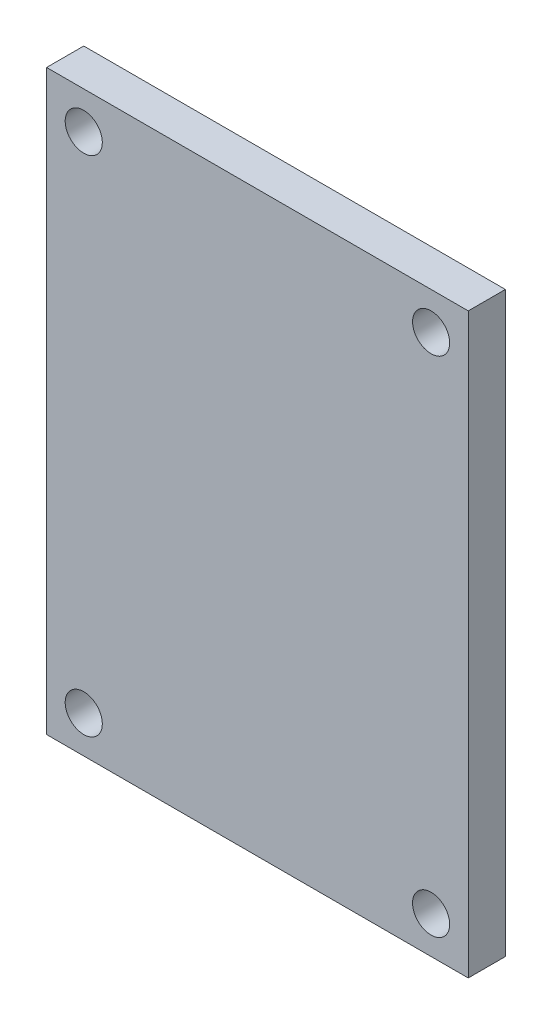
ISO-10303-21;
HEADER;
FILE_DESCRIPTION(('STEP AP214'),'2;1');
FILE_NAME('part.step','',(''),(''),'','','');
FILE_SCHEMA(('AUTOMOTIVE_DESIGN { 1 0 10303 214 1 1 1 1 }'));
ENDSEC;
DATA;
#1=APPLICATION_CONTEXT('core data for automotive mechanical design processes');
#2=APPLICATION_PROTOCOL_DEFINITION('international standard','automotive_design',2000,#1);
#3=PRODUCT_CONTEXT('',#1,'mechanical');
#4=PRODUCT('Part','Part','',(#3));
#5=PRODUCT_RELATED_PRODUCT_CATEGORY('part','',(#4));
#6=PRODUCT_DEFINITION_FORMATION('','',#4);
#7=PRODUCT_DEFINITION_CONTEXT('part definition',#1,'design');
#8=PRODUCT_DEFINITION('design','',#6,#7);
#9=PRODUCT_DEFINITION_SHAPE('','',#8);
#10=(LENGTH_UNIT() NAMED_UNIT(*) SI_UNIT(.MILLI.,.METRE.));
#11=(NAMED_UNIT(*) PLANE_ANGLE_UNIT() SI_UNIT($,.RADIAN.));
#12=(NAMED_UNIT(*) SI_UNIT($,.STERADIAN.) SOLID_ANGLE_UNIT());
#13=UNCERTAINTY_MEASURE_WITH_UNIT(LENGTH_MEASURE(1.E-05),#10,'distance_accuracy_value','');
#14=(GEOMETRIC_REPRESENTATION_CONTEXT(3) GLOBAL_UNCERTAINTY_ASSIGNED_CONTEXT((#13)) GLOBAL_UNIT_ASSIGNED_CONTEXT((#10,
#11,#12)) REPRESENTATION_CONTEXT('',''));
#15=CARTESIAN_POINT('',(0.,0.,0.));
#16=DIRECTION('',(0.,0.,1.));
#17=DIRECTION('',(1.,0.,0.));
#18=AXIS2_PLACEMENT_3D('',#15,#16,#17);
#19=CARTESIAN_POINT('',(17.03,-23.335,3.));
#20=DIRECTION('',(-1.,0.,0.));
#21=DIRECTION('',(0.,0.,1.));
#22=AXIS2_PLACEMENT_3D('',#19,#20,#21);
#23=PLANE('',#22);
#24=DIRECTION('',(0.,1.,0.));
#25=VECTOR('',#24,1.);
#26=CARTESIAN_POINT('',(17.03,-23.335,0.));
#27=LINE('',#26,#25);
#28=CARTESIAN_POINT('',(17.03,-23.335,0.));
#29=VERTEX_POINT('',#28);
#30=CARTESIAN_POINT('',(17.03,23.335,0.));
#31=VERTEX_POINT('',#30);
#32=EDGE_CURVE('E113',#29,#31,#27,.T.);
#33=ORIENTED_EDGE('',*,*,#32,.T.);
#34=DIRECTION('',(0.,0.,-1.));
#35=VECTOR('',#34,1.);
#36=CARTESIAN_POINT('',(17.03,23.335,3.));
#37=LINE('',#36,#35);
#38=CARTESIAN_POINT('',(17.03,23.335,3.));
#39=VERTEX_POINT('',#38);
#40=EDGE_CURVE('E11',#39,#31,#37,.T.);
#41=ORIENTED_EDGE('',*,*,#40,.F.);
#42=DIRECTION('',(0.,1.,0.));
#43=VECTOR('',#42,1.);
#44=CARTESIAN_POINT('',(17.03,-23.335,3.));
#45=LINE('',#44,#43);
#46=CARTESIAN_POINT('',(17.03,-23.335,3.));
#47=VERTEX_POINT('',#46);
#48=EDGE_CURVE('E97',#47,#39,#45,.T.);
#49=ORIENTED_EDGE('',*,*,#48,.F.);
#50=DIRECTION('',(0.,0.,-1.));
#51=VECTOR('',#50,1.);
#52=CARTESIAN_POINT('',(17.03,-23.335,3.));
#53=LINE('',#52,#51);
#54=EDGE_CURVE('E109',#47,#29,#53,.T.);
#55=ORIENTED_EDGE('',*,*,#54,.T.);
#56=EDGE_LOOP('',(#33,#41,#49,#55));
#57=FACE_BOUND('',#56,.T.);
#58=ADVANCED_FACE('F45',(#57),#23,.F.);
#59=CARTESIAN_POINT('',(-17.03,23.335,3.));
#60=DIRECTION('',(0.,-1.,0.));
#61=DIRECTION('',(0.,0.,-1.));
#62=AXIS2_PLACEMENT_3D('',#59,#60,#61);
#63=PLANE('',#62);
#64=DIRECTION('',(-1.,0.,0.));
#65=VECTOR('',#64,1.);
#66=CARTESIAN_POINT('',(-17.03,23.335,0.));
#67=LINE('',#66,#65);
#68=CARTESIAN_POINT('',(-17.03,23.335,0.));
#69=VERTEX_POINT('',#68);
#70=EDGE_CURVE('E102',#31,#69,#67,.T.);
#71=ORIENTED_EDGE('',*,*,#70,.T.);
#72=DIRECTION('',(0.,0.,-1.));
#73=VECTOR('',#72,1.);
#74=CARTESIAN_POINT('',(-17.03,23.335,3.));
#75=LINE('',#74,#73);
#76=CARTESIAN_POINT('',(-17.03,23.335,3.));
#77=VERTEX_POINT('',#76);
#78=EDGE_CURVE('E54',#77,#69,#75,.T.);
#79=ORIENTED_EDGE('',*,*,#78,.F.);
#80=DIRECTION('',(-1.,0.,0.));
#81=VECTOR('',#80,1.);
#82=CARTESIAN_POINT('',(-17.03,23.335,3.));
#83=LINE('',#82,#81);
#84=EDGE_CURVE('E92',#39,#77,#83,.T.);
#85=ORIENTED_EDGE('',*,*,#84,.F.);
#86=ORIENTED_EDGE('',*,*,#40,.T.);
#87=EDGE_LOOP('',(#71,#79,#85,#86));
#88=FACE_BOUND('',#87,.T.);
#89=ADVANCED_FACE('F101',(#88),#63,.F.);
#90=CARTESIAN_POINT('',(-17.03,-23.335,3.));
#91=DIRECTION('',(1.,0.,0.));
#92=DIRECTION('',(0.,0.,-1.));
#93=AXIS2_PLACEMENT_3D('',#90,#91,#92);
#94=PLANE('',#93);
#95=DIRECTION('',(0.,-1.,0.));
#96=VECTOR('',#95,1.);
#97=CARTESIAN_POINT('',(-17.03,-23.335,0.));
#98=LINE('',#97,#96);
#99=CARTESIAN_POINT('',(-17.03,-23.335,0.));
#100=VERTEX_POINT('',#99);
#101=EDGE_CURVE('E79',#69,#100,#98,.T.);
#102=ORIENTED_EDGE('',*,*,#101,.T.);
#103=DIRECTION('',(0.,0.,-1.));
#104=VECTOR('',#103,1.);
#105=CARTESIAN_POINT('',(-17.03,-23.335,3.));
#106=LINE('',#105,#104);
#107=CARTESIAN_POINT('',(-17.03,-23.335,3.));
#108=VERTEX_POINT('',#107);
#109=EDGE_CURVE('E104',#108,#100,#106,.T.);
#110=ORIENTED_EDGE('',*,*,#109,.F.);
#111=DIRECTION('',(0.,-1.,0.));
#112=VECTOR('',#111,1.);
#113=CARTESIAN_POINT('',(-17.03,-23.335,3.));
#114=LINE('',#113,#112);
#115=EDGE_CURVE('E95',#77,#108,#114,.T.);
#116=ORIENTED_EDGE('',*,*,#115,.F.);
#117=ORIENTED_EDGE('',*,*,#78,.T.);
#118=EDGE_LOOP('',(#102,#110,#116,#117));
#119=FACE_BOUND('',#118,.T.);
#120=ADVANCED_FACE('F105',(#119),#94,.F.);
#121=CARTESIAN_POINT('',(-17.03,-23.335,3.));
#122=DIRECTION('',(0.,1.,0.));
#123=DIRECTION('',(0.,0.,1.));
#124=AXIS2_PLACEMENT_3D('',#121,#122,#123);
#125=PLANE('',#124);
#126=DIRECTION('',(1.,0.,0.));
#127=VECTOR('',#126,1.);
#128=CARTESIAN_POINT('',(-17.03,-23.335,0.));
#129=LINE('',#128,#127);
#130=EDGE_CURVE('E85',#100,#29,#129,.T.);
#131=ORIENTED_EDGE('',*,*,#130,.T.);
#132=ORIENTED_EDGE('',*,*,#54,.F.);
#133=DIRECTION('',(1.,0.,0.));
#134=VECTOR('',#133,1.);
#135=CARTESIAN_POINT('',(-17.03,-23.335,3.));
#136=LINE('',#135,#134);
#137=EDGE_CURVE('E62',#108,#47,#136,.T.);
#138=ORIENTED_EDGE('',*,*,#137,.F.);
#139=ORIENTED_EDGE('',*,*,#109,.T.);
#140=EDGE_LOOP('',(#131,#132,#138,#139));
#141=FACE_BOUND('',#140,.T.);
#142=ADVANCED_FACE('F127',(#141),#125,.F.);
#143=CARTESIAN_POINT('',(0.,0.,3.));
#144=DIRECTION('',(0.,0.,-1.));
#145=DIRECTION('',(-1.,0.,0.));
#146=AXIS2_PLACEMENT_3D('',#143,#144,#145);
#147=PLANE('',#146);
#148=CARTESIAN_POINT('',(-14.03,-20.335,3.));
#149=DIRECTION('',(0.,0.,1.));
#150=DIRECTION('',(1.,0.,0.));
#151=AXIS2_PLACEMENT_3D('',#148,#149,#150);
#152=CIRCLE('',#151,1.5);
#153=CARTESIAN_POINT('',(-12.53,-20.335,3.));
#154=VERTEX_POINT('',#153);
#155=EDGE_CURVE('E146',#154,#154,#152,.T.);
#156=ORIENTED_EDGE('',*,*,#155,.F.);
#157=EDGE_LOOP('',(#156));
#158=FACE_BOUND('',#157,.T.);
#159=CARTESIAN_POINT('',(14.03,-20.335,3.));
#160=DIRECTION('',(0.,0.,1.));
#161=DIRECTION('',(1.,0.,0.));
#162=AXIS2_PLACEMENT_3D('',#159,#160,#161);
#163=CIRCLE('',#162,1.5);
#164=CARTESIAN_POINT('',(15.53,-20.335,3.));
#165=VERTEX_POINT('',#164);
#166=EDGE_CURVE('E154',#165,#165,#163,.T.);
#167=ORIENTED_EDGE('',*,*,#166,.F.);
#168=EDGE_LOOP('',(#167));
#169=FACE_BOUND('',#168,.T.);
#170=CARTESIAN_POINT('',(14.03,20.335,3.));
#171=DIRECTION('',(0.,0.,1.));
#172=DIRECTION('',(1.,0.,0.));
#173=AXIS2_PLACEMENT_3D('',#170,#171,#172);
#174=CIRCLE('',#173,1.5);
#175=CARTESIAN_POINT('',(15.53,20.335,3.));
#176=VERTEX_POINT('',#175);
#177=EDGE_CURVE('E138',#176,#176,#174,.T.);
#178=ORIENTED_EDGE('',*,*,#177,.F.);
#179=EDGE_LOOP('',(#178));
#180=FACE_BOUND('',#179,.T.);
#181=CARTESIAN_POINT('',(-14.03,20.335,3.));
#182=DIRECTION('',(0.,0.,1.));
#183=DIRECTION('',(1.,0.,0.));
#184=AXIS2_PLACEMENT_3D('',#181,#182,#183);
#185=CIRCLE('',#184,1.5);
#186=CARTESIAN_POINT('',(-12.53,20.335,3.));
#187=VERTEX_POINT('',#186);
#188=EDGE_CURVE('E134',#187,#187,#185,.T.);
#189=ORIENTED_EDGE('',*,*,#188,.F.);
#190=EDGE_LOOP('',(#189));
#191=FACE_BOUND('',#190,.T.);
#192=ORIENTED_EDGE('',*,*,#48,.T.);
#193=ORIENTED_EDGE('',*,*,#84,.T.);
#194=ORIENTED_EDGE('',*,*,#115,.T.);
#195=ORIENTED_EDGE('',*,*,#137,.T.);
#196=EDGE_LOOP('',(#192,#193,#194,#195));
#197=FACE_BOUND('',#196,.T.);
#198=ADVANCED_FACE('F93',(#158,#169,#180,#191,#197),#147,.F.);
#199=CARTESIAN_POINT('',(0.,0.,0.));
#200=DIRECTION('',(0.,0.,-1.));
#201=DIRECTION('',(-1.,0.,0.));
#202=AXIS2_PLACEMENT_3D('',#199,#200,#201);
#203=PLANE('',#202);
#204=CARTESIAN_POINT('',(-14.03,-20.335,0.));
#205=DIRECTION('',(0.,0.,1.));
#206=DIRECTION('',(1.,0.,0.));
#207=AXIS2_PLACEMENT_3D('',#204,#205,#206);
#208=CIRCLE('',#207,1.5);
#209=CARTESIAN_POINT('',(-12.53,-20.335,0.));
#210=VERTEX_POINT('',#209);
#211=EDGE_CURVE('E142',#210,#210,#208,.T.);
#212=ORIENTED_EDGE('',*,*,#211,.T.);
#213=EDGE_LOOP('',(#212));
#214=FACE_BOUND('',#213,.T.);
#215=CARTESIAN_POINT('',(14.03,-20.335,0.));
#216=DIRECTION('',(0.,0.,1.));
#217=DIRECTION('',(1.,0.,0.));
#218=AXIS2_PLACEMENT_3D('',#215,#216,#217);
#219=CIRCLE('',#218,1.5);
#220=CARTESIAN_POINT('',(15.53,-20.335,0.));
#221=VERTEX_POINT('',#220);
#222=EDGE_CURVE('E150',#221,#221,#219,.T.);
#223=ORIENTED_EDGE('',*,*,#222,.T.);
#224=EDGE_LOOP('',(#223));
#225=FACE_BOUND('',#224,.T.);
#226=CARTESIAN_POINT('',(14.03,20.335,0.));
#227=DIRECTION('',(0.,0.,1.));
#228=DIRECTION('',(1.,0.,0.));
#229=AXIS2_PLACEMENT_3D('',#226,#227,#228);
#230=CIRCLE('',#229,1.5);
#231=CARTESIAN_POINT('',(15.53,20.335,0.));
#232=VERTEX_POINT('',#231);
#233=EDGE_CURVE('E158',#232,#232,#230,.T.);
#234=ORIENTED_EDGE('',*,*,#233,.T.);
#235=EDGE_LOOP('',(#234));
#236=FACE_BOUND('',#235,.T.);
#237=CARTESIAN_POINT('',(-14.03,20.335,0.));
#238=DIRECTION('',(0.,0.,1.));
#239=DIRECTION('',(1.,0.,0.));
#240=AXIS2_PLACEMENT_3D('',#237,#238,#239);
#241=CIRCLE('',#240,1.5);
#242=CARTESIAN_POINT('',(-12.53,20.335,0.));
#243=VERTEX_POINT('',#242);
#244=EDGE_CURVE('E117',#243,#243,#241,.T.);
#245=ORIENTED_EDGE('',*,*,#244,.T.);
#246=EDGE_LOOP('',(#245));
#247=FACE_BOUND('',#246,.T.);
#248=ORIENTED_EDGE('',*,*,#32,.F.);
#249=ORIENTED_EDGE('',*,*,#130,.F.);
#250=ORIENTED_EDGE('',*,*,#101,.F.);
#251=ORIENTED_EDGE('',*,*,#70,.F.);
#252=EDGE_LOOP('',(#248,#249,#250,#251));
#253=FACE_BOUND('',#252,.T.);
#254=ADVANCED_FACE('F130',(#214,#225,#236,#247,#253),#203,.T.);
#255=CARTESIAN_POINT('',(-14.03,20.335,0.));
#256=DIRECTION('',(0.,0.,1.));
#257=DIRECTION('',(1.,0.,0.));
#258=AXIS2_PLACEMENT_3D('',#255,#256,#257);
#259=CYLINDRICAL_SURFACE('',#258,1.5);
#260=ORIENTED_EDGE('',*,*,#244,.F.);
#261=EDGE_LOOP('',(#260));
#262=FACE_BOUND('',#261,.T.);
#263=ORIENTED_EDGE('',*,*,#188,.T.);
#264=EDGE_LOOP('',(#263));
#265=FACE_BOUND('',#264,.T.);
#266=ADVANCED_FACE('F174',(#262,#265),#259,.F.);
#267=CARTESIAN_POINT('',(14.03,20.335,0.));
#268=DIRECTION('',(0.,0.,1.));
#269=DIRECTION('',(1.,0.,0.));
#270=AXIS2_PLACEMENT_3D('',#267,#268,#269);
#271=CYLINDRICAL_SURFACE('',#270,1.5);
#272=ORIENTED_EDGE('',*,*,#233,.F.);
#273=EDGE_LOOP('',(#272));
#274=FACE_BOUND('',#273,.T.);
#275=ORIENTED_EDGE('',*,*,#177,.T.);
#276=EDGE_LOOP('',(#275));
#277=FACE_BOUND('',#276,.T.);
#278=ADVANCED_FACE('F166',(#274,#277),#271,.F.);
#279=CARTESIAN_POINT('',(14.03,-20.335,0.));
#280=DIRECTION('',(0.,0.,1.));
#281=DIRECTION('',(1.,0.,0.));
#282=AXIS2_PLACEMENT_3D('',#279,#280,#281);
#283=CYLINDRICAL_SURFACE('',#282,1.5);
#284=ORIENTED_EDGE('',*,*,#222,.F.);
#285=EDGE_LOOP('',(#284));
#286=FACE_BOUND('',#285,.T.);
#287=ORIENTED_EDGE('',*,*,#166,.T.);
#288=EDGE_LOOP('',(#287));
#289=FACE_BOUND('',#288,.T.);
#290=ADVANCED_FACE('F182',(#286,#289),#283,.F.);
#291=CARTESIAN_POINT('',(-14.03,-20.335,0.));
#292=DIRECTION('',(0.,0.,1.));
#293=DIRECTION('',(1.,0.,0.));
#294=AXIS2_PLACEMENT_3D('',#291,#292,#293);
#295=CYLINDRICAL_SURFACE('',#294,1.5);
#296=ORIENTED_EDGE('',*,*,#211,.F.);
#297=EDGE_LOOP('',(#296));
#298=FACE_BOUND('',#297,.T.);
#299=ORIENTED_EDGE('',*,*,#155,.T.);
#300=EDGE_LOOP('',(#299));
#301=FACE_BOUND('',#300,.T.);
#302=ADVANCED_FACE('F233',(#298,#301),#295,.F.);
#303=CLOSED_SHELL('',(#58,#89,#120,#142,#198,#254,#266,#278,#290,#302));
#304=MANIFOLD_SOLID_BREP('B2',#303);
#305=ADVANCED_BREP_SHAPE_REPRESENTATION('',(#18,#304),#14);
#306=SHAPE_DEFINITION_REPRESENTATION(#9,#305);
ENDSEC;
END-ISO-10303-21;
